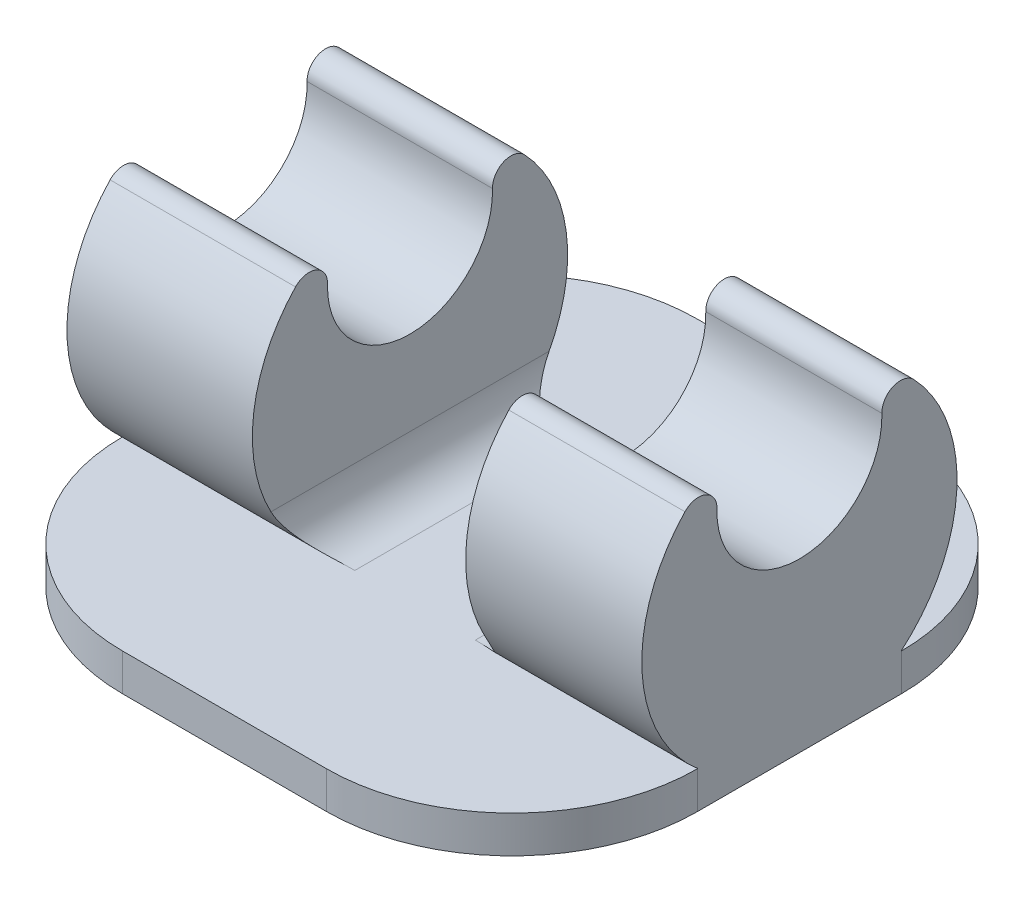
ISO-10303-21;
HEADER;
FILE_DESCRIPTION(('STEP AP214'),'2;1');
FILE_NAME('part.step','',(''),(''),'','','');
FILE_SCHEMA(('AUTOMOTIVE_DESIGN { 1 0 10303 214 1 1 1 1 }'));
ENDSEC;
DATA;
#1=APPLICATION_CONTEXT('core data for automotive mechanical design processes');
#2=APPLICATION_PROTOCOL_DEFINITION('international standard','automotive_design',2000,#1);
#3=PRODUCT_CONTEXT('',#1,'mechanical');
#4=PRODUCT('Part','Part','',(#3));
#5=PRODUCT_RELATED_PRODUCT_CATEGORY('part','',(#4));
#6=PRODUCT_DEFINITION_FORMATION('','',#4);
#7=PRODUCT_DEFINITION_CONTEXT('part definition',#1,'design');
#8=PRODUCT_DEFINITION('design','',#6,#7);
#9=PRODUCT_DEFINITION_SHAPE('','',#8);
#10=(LENGTH_UNIT() NAMED_UNIT(*) SI_UNIT(.MILLI.,.METRE.));
#11=(NAMED_UNIT(*) PLANE_ANGLE_UNIT() SI_UNIT($,.RADIAN.));
#12=(NAMED_UNIT(*) SI_UNIT($,.STERADIAN.) SOLID_ANGLE_UNIT());
#13=UNCERTAINTY_MEASURE_WITH_UNIT(LENGTH_MEASURE(1.E-05),#10,'distance_accuracy_value','');
#14=(GEOMETRIC_REPRESENTATION_CONTEXT(3) GLOBAL_UNCERTAINTY_ASSIGNED_CONTEXT((#13)) GLOBAL_UNIT_ASSIGNED_CONTEXT((#10,
#11,#12)) REPRESENTATION_CONTEXT('',''));
#15=CARTESIAN_POINT('',(0.,0.,0.));
#16=DIRECTION('',(0.,0.,1.));
#17=DIRECTION('',(1.,0.,0.));
#18=AXIS2_PLACEMENT_3D('',#15,#16,#17);
#19=CARTESIAN_POINT('',(-39.5416305603426,8.5,0.));
#20=DIRECTION('',(1.,0.,0.));
#21=DIRECTION('',(0.,0.,-1.));
#22=AXIS2_PLACEMENT_3D('',#19,#20,#21);
#23=CYLINDRICAL_SURFACE('',#22,8.5);
#24=DIRECTION('',(1.,0.,0.));
#25=VECTOR('',#24,1.);
#26=CARTESIAN_POINT('',(-39.5416305603426,2.,5.47722557505166));
#27=LINE('',#26,#25);
#28=CARTESIAN_POINT('',(-15.5,2.,5.47722557505166));
#29=VERTEX_POINT('',#28);
#30=CARTESIAN_POINT('',(-3.,2.,5.47722557505166));
#31=VERTEX_POINT('',#30);
#32=EDGE_CURVE('E314',#29,#31,#27,.T.);
#33=ORIENTED_EDGE('',*,*,#32,.T.);
#34=CARTESIAN_POINT('',(-3.,2.,5.47722557505166));
#35=CARTESIAN_POINT('',(-3.05548023041886,1.99998284746765,5.47719636901179));
#36=CARTESIAN_POINT('',(-3.11093976646165,2.00184610466647,5.47941629204733));
#37=CARTESIAN_POINT('',(-3.22119882620686,2.00919768867053,5.48812748877616));
#38=CARTESIAN_POINT('',(-3.27599921935154,2.01468054270178,5.49461231394811));
#39=CARTESIAN_POINT('',(-3.38380705108872,2.02904505026246,5.51152023657051));
#40=CARTESIAN_POINT('',(-3.43682839160024,2.03788291539298,5.52189257433259));
#41=CARTESIAN_POINT('',(-3.54140164088745,2.05874416325179,5.54621328304563));
#42=CARTESIAN_POINT('',(-3.59295307436981,2.07076856369151,5.5601627964241));
#43=CARTESIAN_POINT('',(-3.74431829426671,2.11110235943785,5.60657231105085));
#44=CARTESIAN_POINT('',(-3.84157745794116,2.14377545707765,5.6437180809062));
#45=CARTESIAN_POINT('',(-4.02819205184219,2.21898803826872,5.72730885639334));
#46=CARTESIAN_POINT('',(-4.11751542478814,2.26156523004117,5.7737893074715));
#47=CARTESIAN_POINT('',(-4.33666214107741,2.38181681439448,5.90163160556171));
#48=CARTESIAN_POINT('',(-4.46037065844433,2.46562393639699,5.98772143833488));
#49=CARTESIAN_POINT('',(-4.68781633607019,2.64993031431786,6.16793360602193));
#50=CARTESIAN_POINT('',(-4.79151879600049,2.75045801959423,6.26206949593661));
#51=CARTESIAN_POINT('',(-4.98214906755177,2.96938192705504,6.45634276600356));
#52=CARTESIAN_POINT('',(-5.0684453392679,3.08824135689828,6.55657578748104));
#53=CARTESIAN_POINT('',(-5.21914818800818,3.33949467404703,6.75609617537811));
#54=CARTESIAN_POINT('',(-5.28359533527579,3.47186287627854,6.85538495803365));
#55=CARTESIAN_POINT('',(-5.36252038858448,3.67905733486903,7.00111906576872));
#56=CARTESIAN_POINT('',(-5.38586177931541,3.7495142777769,7.04913397646161));
#57=CARTESIAN_POINT('',(-5.42635856559128,3.89308550359085,7.14378894845126));
#58=CARTESIAN_POINT('',(-5.4435151732474,3.96619926271133,7.19042927749534));
#59=CARTESIAN_POINT('',(-5.4713430315428,4.11501409200851,7.28213942312598));
#60=CARTESIAN_POINT('',(-5.48198950433371,4.19072390309594,7.32720263150957));
#61=CARTESIAN_POINT('',(-5.49632054031548,4.34405667695937,7.41525510977456));
#62=CARTESIAN_POINT('',(-5.49999987655529,4.42168103189121,7.45824279899818));
#63=CARTESIAN_POINT('',(-5.5,4.5,7.5));
#64=B_SPLINE_CURVE_WITH_KNOTS('',3,(#34,#35,#36,#37,#38,#39,#40,#41,#42,#43,#44,#45,#46,#47,#48,
#49,#50,#51,#52,#53,#54,#55,#56,#57,#58,#59,#60,#61,#62,#63),.UNSPECIFIED.,.F.,.F.,(4,2,2,2,2,2,
2,2,2,2,2,2,2,2,4),(0.,0.166331758041029,0.332412599287027,0.496396452068247,0.660432741045884,
0.986280067977534,1.31338892060558,1.8278986510474,2.34329292491729,2.87492741890114,
3.40556927769404,3.67054852451768,3.93547581169413,4.20140524723328,4.46753411194576),.UNSPECIFIED.);
#65=CARTESIAN_POINT('',(-5.5,4.5,7.5));
#66=VERTEX_POINT('',#65);
#67=EDGE_CURVE('E47',#31,#66,#64,.T.);
#68=ORIENTED_EDGE('',*,*,#67,.T.);
#69=CARTESIAN_POINT('',(-5.5,8.5,0.));
#70=DIRECTION('',(1.,0.,0.));
#71=DIRECTION('',(0.,0.,-1.));
#72=AXIS2_PLACEMENT_3D('',#69,#70,#71);
#73=CIRCLE('',#72,8.5);
#74=CARTESIAN_POINT('',(-5.5,14.34205,6.17417620395627));
#75=VERTEX_POINT('',#74);
#76=EDGE_CURVE('E389',#66,#75,#73,.F.);
#77=ORIENTED_EDGE('',*,*,#76,.T.);
#78=DIRECTION('',(1.,0.,0.));
#79=VECTOR('',#78,1.);
#80=CARTESIAN_POINT('',(-39.5416305603426,14.34205,6.17417620395628));
#81=LINE('',#80,#79);
#82=CARTESIAN_POINT('',(-15.5,14.34205,6.17417620395628));
#83=VERTEX_POINT('',#82);
#84=EDGE_CURVE('E353',#75,#83,#81,.F.);
#85=ORIENTED_EDGE('',*,*,#84,.T.);
#86=CARTESIAN_POINT('',(-15.5,8.5,0.));
#87=DIRECTION('',(1.,0.,0.));
#88=DIRECTION('',(0.,0.,-1.));
#89=AXIS2_PLACEMENT_3D('',#86,#87,#88);
#90=CIRCLE('',#89,8.5);
#91=EDGE_CURVE('E371',#29,#83,#90,.F.);
#92=ORIENTED_EDGE('',*,*,#91,.F.);
#93=EDGE_LOOP('',(#33,#68,#77,#85,#92));
#94=FACE_BOUND('',#93,.T.);
#95=ADVANCED_FACE('F33',(#94),#23,.T.);
#96=CARTESIAN_POINT('',(15.5,14.34205,6.17417620395628));
#97=VERTEX_POINT('',#96);
#98=CARTESIAN_POINT('',(6.00222215077043,14.34205,6.17417620395627));
#99=VERTEX_POINT('',#98);
#100=EDGE_CURVE('E354',#97,#99,#81,.F.);
#101=ORIENTED_EDGE('',*,*,#100,.T.);
#102=CARTESIAN_POINT('',(6.00222215077043,8.5,0.));
#103=DIRECTION('',(-1.,0.,0.));
#104=DIRECTION('',(0.,0.,1.));
#105=AXIS2_PLACEMENT_3D('',#102,#103,#104);
#106=CIRCLE('',#105,8.5);
#107=CARTESIAN_POINT('',(6.00222215077043,4.5,7.5));
#108=VERTEX_POINT('',#107);
#109=EDGE_CURVE('E306',#99,#108,#106,.F.);
#110=ORIENTED_EDGE('',*,*,#109,.T.);
#111=CARTESIAN_POINT('',(6.00222215077043,4.5,7.5));
#112=CARTESIAN_POINT('',(6.00222013599766,4.40532480934401,7.44953326205885));
#113=CARTESIAN_POINT('',(5.99684630339004,4.31168824367521,7.39726593031392));
#114=CARTESIAN_POINT('',(5.97603320552884,4.12737359556319,7.28981472068751));
#115=CARTESIAN_POINT('',(5.96060467770965,4.0366924653497,7.23463401171225));
#116=CARTESIAN_POINT('',(5.92043899443468,3.8593244330836,7.12215851426623));
#117=CARTESIAN_POINT('',(5.8957397732062,3.77262284829421,7.0648731878205));
#118=CARTESIAN_POINT('',(5.83761657626143,3.60337258045722,6.94863943451439));
#119=CARTESIAN_POINT('',(5.80419105113062,3.52082463802474,6.88969071396662));
#120=CARTESIAN_POINT('',(5.70146275915986,3.30124661375149,6.72703049502711));
#121=CARTESIAN_POINT('',(5.62385098719026,3.16878408124438,6.62227486692107));
#122=CARTESIAN_POINT('',(5.44533872410232,2.9195420303512,6.41365137460118));
#123=CARTESIAN_POINT('',(5.3444160585914,2.80277761311708,6.30978445395079));
#124=CARTESIAN_POINT('',(5.13796983265693,2.60492921756946,6.1248169308011));
#125=CARTESIAN_POINT('',(5.03589691300799,2.52113289666896,6.04277078203783));
#126=CARTESIAN_POINT('',(4.81517493186919,2.36830609955503,5.88762369576226));
#127=CARTESIAN_POINT('',(4.69655515786057,2.2992500682568,5.81450737245681));
#128=CARTESIAN_POINT('',(4.47985251634314,2.19694257137392,5.70310709388875));
#129=CARTESIAN_POINT('',(4.38595995944275,2.15913108053088,5.66089819682788));
#130=CARTESIAN_POINT('',(4.19058805168241,2.09445023809222,5.58760440377984));
#131=CARTESIAN_POINT('',(4.08913676885014,2.06754258098347,5.55648061297145));
#132=CARTESIAN_POINT('',(3.90687856980701,2.03169044290814,5.51466524375957));
#133=CARTESIAN_POINT('',(3.82736720599581,2.01992012646884,5.50079276661133));
#134=CARTESIAN_POINT('',(3.70650941242318,2.00802787600596,5.4867415430092));
#135=CARTESIAN_POINT('',(3.66581146901542,2.00502404431862,5.48318358859945));
#136=CARTESIAN_POINT('',(3.58415462014763,2.00100768816681,5.47842161633531));
#137=CARTESIAN_POINT('',(3.54319556375304,1.99999644499591,5.47721911310887));
#138=CARTESIAN_POINT('',(3.50222215077043,2.,5.47722557505166));
#139=B_SPLINE_CURVE_WITH_KNOTS('',3,(#111,#112,#113,#114,#115,#116,#117,#118,#119,#120,#121,
#122,#123,#124,#125,#126,#127,#128,#129,#130,#131,#132,#133,#134,#135,#136,#137,#138),
.UNSPECIFIED.,.F.,.F.,(4,2,2,2,2,2,2,2,2,2,2,2,2,4),(0.,0.321602761200091,0.642862643540117,
0.962822062945265,1.28283833200233,1.83815009571004,2.39399228893269,2.85894682584426,
3.32308860846619,3.65100743990798,3.97776408149686,4.22158813914863,4.34437237887189,
4.46723554677396),.UNSPECIFIED.);
#140=CARTESIAN_POINT('',(3.50222215077042,2.,5.47722557505166));
#141=VERTEX_POINT('',#140);
#142=EDGE_CURVE('E272',#108,#141,#139,.T.);
#143=ORIENTED_EDGE('',*,*,#142,.T.);
#144=CARTESIAN_POINT('',(15.5,2.,5.47722557505166));
#145=VERTEX_POINT('',#144);
#146=EDGE_CURVE('E304',#141,#145,#27,.T.);
#147=ORIENTED_EDGE('',*,*,#146,.T.);
#148=CARTESIAN_POINT('',(15.5,8.5,0.));
#149=DIRECTION('',(1.,0.,0.));
#150=DIRECTION('',(0.,0.,-1.));
#151=AXIS2_PLACEMENT_3D('',#148,#149,#150);
#152=CIRCLE('',#151,8.5);
#153=EDGE_CURVE('E395',#97,#145,#152,.T.);
#154=ORIENTED_EDGE('',*,*,#153,.F.);
#155=EDGE_LOOP('',(#101,#110,#143,#147,#154));
#156=FACE_BOUND('',#155,.T.);
#157=ADVANCED_FACE('F284',(#156),#23,.T.);
#158=DIRECTION('',(1.,0.,0.));
#159=VECTOR('',#158,1.);
#160=CARTESIAN_POINT('',(-39.5416305603426,14.34205,-6.17417620395628));
#161=LINE('',#160,#159);
#162=CARTESIAN_POINT('',(-15.5,14.34205,-6.17417620395629));
#163=VERTEX_POINT('',#162);
#164=CARTESIAN_POINT('',(-5.5,14.34205,-6.17417620395629));
#165=VERTEX_POINT('',#164);
#166=EDGE_CURVE('E208',#163,#165,#161,.T.);
#167=ORIENTED_EDGE('',*,*,#166,.T.);
#168=CARTESIAN_POINT('',(-5.5,8.5,0.));
#169=DIRECTION('',(1.,0.,0.));
#170=DIRECTION('',(0.,0.,-1.));
#171=AXIS2_PLACEMENT_3D('',#168,#169,#170);
#172=CIRCLE('',#171,8.5);
#173=CARTESIAN_POINT('',(-5.5,4.5,-7.5));
#174=VERTEX_POINT('',#173);
#175=EDGE_CURVE('E379',#165,#174,#172,.F.);
#176=ORIENTED_EDGE('',*,*,#175,.T.);
#177=CARTESIAN_POINT('',(-5.5,4.5,-7.5));
#178=CARTESIAN_POINT('',(-5.49999798522723,4.40532480934401,-7.44953326205885));
#179=CARTESIAN_POINT('',(-5.49462415261961,4.31168824367521,-7.39726593031392));
#180=CARTESIAN_POINT('',(-5.47381105475841,4.12737359556319,-7.28981472068751));
#181=CARTESIAN_POINT('',(-5.45838252693921,4.0366924653497,-7.23463401171225));
#182=CARTESIAN_POINT('',(-5.41821684366424,3.8593244330836,-7.12215851426623));
#183=CARTESIAN_POINT('',(-5.39351762243576,3.77262284829421,-7.06487318782051));
#184=CARTESIAN_POINT('',(-5.335394425491,3.60337258045722,-6.94863943451439));
#185=CARTESIAN_POINT('',(-5.30196890036019,3.52082463802474,-6.88969071396662));
#186=CARTESIAN_POINT('',(-5.19924060838942,3.30124661375149,-6.72703049502711));
#187=CARTESIAN_POINT('',(-5.12162883641983,3.16878408124439,-6.62227486692107));
#188=CARTESIAN_POINT('',(-4.94311657333189,2.9195420303512,-6.41365137460118));
#189=CARTESIAN_POINT('',(-4.84219390782097,2.80277761311708,-6.30978445395079));
#190=CARTESIAN_POINT('',(-4.6357476818865,2.60492921756946,-6.1248169308011));
#191=CARTESIAN_POINT('',(-4.53367476223755,2.52113289666896,-6.04277078203783));
#192=CARTESIAN_POINT('',(-4.31295278109875,2.36830609955503,-5.88762369576226));
#193=CARTESIAN_POINT('',(-4.19433300709013,2.2992500682568,-5.8145073724568));
#194=CARTESIAN_POINT('',(-3.9776303655727,2.19694257137392,-5.70310709388874));
#195=CARTESIAN_POINT('',(-3.88373780867232,2.15913108053088,-5.66089819682788));
#196=CARTESIAN_POINT('',(-3.68836590091197,2.09445023809222,-5.58760440377984));
#197=CARTESIAN_POINT('',(-3.5869146180797,2.06754258098347,-5.55648061297145));
#198=CARTESIAN_POINT('',(-3.40465641903657,2.03169044290814,-5.51466524375957));
#199=CARTESIAN_POINT('',(-3.32514505522537,2.01992012646884,-5.50079276661133));
#200=CARTESIAN_POINT('',(-3.20428726165274,2.00802787600596,-5.4867415430092));
#201=CARTESIAN_POINT('',(-3.16358931824499,2.00502404431862,-5.48318358859945));
#202=CARTESIAN_POINT('',(-3.08193246937719,2.00100768816681,-5.47842161633531));
#203=CARTESIAN_POINT('',(-3.04097341298261,1.99999644499591,-5.47721911310888));
#204=CARTESIAN_POINT('',(-3.,2.,-5.47722557505166));
#205=B_SPLINE_CURVE_WITH_KNOTS('',3,(#177,#178,#179,#180,#181,#182,#183,#184,#185,#186,#187,
#188,#189,#190,#191,#192,#193,#194,#195,#196,#197,#198,#199,#200,#201,#202,#203,#204),
.UNSPECIFIED.,.F.,.F.,(4,2,2,2,2,2,2,2,2,2,2,2,2,4),(0.,0.321602761200091,0.642862643540117,
0.962822062945264,1.28283833200233,1.83815009571004,2.39399228893269,2.85894682584426,
3.3230886084662,3.65100743990798,3.97776408149686,4.22158813914863,4.34437237887189,
4.46723554677396),.UNSPECIFIED.);
#206=CARTESIAN_POINT('',(-3.00000000000002,2.,-5.47722557505166));
#207=VERTEX_POINT('',#206);
#208=EDGE_CURVE('E11',#174,#207,#205,.T.);
#209=ORIENTED_EDGE('',*,*,#208,.T.);
#210=DIRECTION('',(1.,0.,0.));
#211=VECTOR('',#210,1.);
#212=CARTESIAN_POINT('',(-39.5416305603426,2.,-5.47722557505166));
#213=LINE('',#212,#211);
#214=CARTESIAN_POINT('',(-15.5,2.,-5.47722557505166));
#215=VERTEX_POINT('',#214);
#216=EDGE_CURVE('E317',#207,#215,#213,.F.);
#217=ORIENTED_EDGE('',*,*,#216,.T.);
#218=EDGE_CURVE('E362',#163,#215,#90,.F.);
#219=ORIENTED_EDGE('',*,*,#218,.F.);
#220=EDGE_LOOP('',(#167,#176,#209,#217,#219));
#221=FACE_BOUND('',#220,.T.);
#222=ADVANCED_FACE('F370',(#221),#23,.T.);
#223=CARTESIAN_POINT('',(15.5,2.,-5.47722557505166));
#224=VERTEX_POINT('',#223);
#225=CARTESIAN_POINT('',(3.50222215077043,2.,-5.47722557505166));
#226=VERTEX_POINT('',#225);
#227=EDGE_CURVE('E310',#224,#226,#213,.F.);
#228=ORIENTED_EDGE('',*,*,#227,.T.);
#229=CARTESIAN_POINT('',(3.50222215077043,2.,-5.47722557505166));
#230=CARTESIAN_POINT('',(3.55770238118929,1.99998284746765,-5.47719636901179));
#231=CARTESIAN_POINT('',(3.61316191723208,2.00184610466647,-5.47941629204732));
#232=CARTESIAN_POINT('',(3.7234209769773,2.00919768867053,-5.48812748877616));
#233=CARTESIAN_POINT('',(3.77822137012197,2.01468054270178,-5.49461231394811));
#234=CARTESIAN_POINT('',(3.88602920185915,2.02904505026246,-5.51152023657051));
#235=CARTESIAN_POINT('',(3.93905054237068,2.03788291539298,-5.52189257433259));
#236=CARTESIAN_POINT('',(4.04362379165788,2.05874416325179,-5.54621328304563));
#237=CARTESIAN_POINT('',(4.09517522514024,2.07076856369151,-5.56016279642409));
#238=CARTESIAN_POINT('',(4.24654044503714,2.11110235943785,-5.60657231105085));
#239=CARTESIAN_POINT('',(4.34379960871159,2.14377545707765,-5.6437180809062));
#240=CARTESIAN_POINT('',(4.53041420261262,2.21898803826872,-5.72730885639333));
#241=CARTESIAN_POINT('',(4.61973757555857,2.26156523004117,-5.7737893074715));
#242=CARTESIAN_POINT('',(4.83888429184784,2.38181681439448,-5.90163160556171));
#243=CARTESIAN_POINT('',(4.96259280921476,2.46562393639698,-5.98772143833488));
#244=CARTESIAN_POINT('',(5.19003848684062,2.64993031431785,-6.16793360602192));
#245=CARTESIAN_POINT('',(5.29374094677092,2.75045801959422,-6.26206949593661));
#246=CARTESIAN_POINT('',(5.4843712183222,2.96938192705503,-6.45634276600355));
#247=CARTESIAN_POINT('',(5.57066749003833,3.08824135689827,-6.55657578748103));
#248=CARTESIAN_POINT('',(5.7213703387786,3.33949467404702,-6.7560961753781));
#249=CARTESIAN_POINT('',(5.78581748604622,3.47186287627852,-6.85538495803365));
#250=CARTESIAN_POINT('',(5.86474253935491,3.67905733486902,-7.00111906576872));
#251=CARTESIAN_POINT('',(5.88808393008584,3.74951427777688,-7.0491339764616));
#252=CARTESIAN_POINT('',(5.92858071636171,3.89308550359084,-7.14378894845125));
#253=CARTESIAN_POINT('',(5.94573732401783,3.96619926271132,-7.19042927749533));
#254=CARTESIAN_POINT('',(5.97356518231323,4.11501409200851,-7.28213942312597));
#255=CARTESIAN_POINT('',(5.98421165510414,4.19072390309594,-7.32720263150957));
#256=CARTESIAN_POINT('',(5.99854269108592,4.34405667695937,-7.41525510977456));
#257=CARTESIAN_POINT('',(6.00222202732572,4.42168103189121,-7.45824279899818));
#258=CARTESIAN_POINT('',(6.00222215077043,4.5,-7.5));
#259=B_SPLINE_CURVE_WITH_KNOTS('',3,(#229,#230,#231,#232,#233,#234,#235,#236,#237,#238,#239,
#240,#241,#242,#243,#244,#245,#246,#247,#248,#249,#250,#251,#252,#253,#254,#255,#256,#257,#258),
.UNSPECIFIED.,.F.,.F.,(4,2,2,2,2,2,2,2,2,2,2,2,2,2,4),(0.,0.166331758041029,0.332412599287026,
0.496396452068246,0.660432741045882,0.986280067977531,1.31338892060558,1.82789865104739,
2.34329292491728,2.87492741890113,3.40556927769402,3.67054852451766,3.93547581169412,
4.20140524723327,4.46753411194576),.UNSPECIFIED.);
#260=CARTESIAN_POINT('',(6.00222215077043,4.5,-7.5));
#261=VERTEX_POINT('',#260);
#262=EDGE_CURVE('E194',#226,#261,#259,.T.);
#263=ORIENTED_EDGE('',*,*,#262,.T.);
#264=CARTESIAN_POINT('',(6.00222215077043,8.5,0.));
#265=DIRECTION('',(-1.,0.,0.));
#266=DIRECTION('',(0.,0.,1.));
#267=AXIS2_PLACEMENT_3D('',#264,#265,#266);
#268=CIRCLE('',#267,8.5);
#269=CARTESIAN_POINT('',(6.00222215077043,14.34205,-6.17417620395629));
#270=VERTEX_POINT('',#269);
#271=EDGE_CURVE('E186',#261,#270,#268,.F.);
#272=ORIENTED_EDGE('',*,*,#271,.T.);
#273=CARTESIAN_POINT('',(15.5,14.34205,-6.17417620395629));
#274=VERTEX_POINT('',#273);
#275=EDGE_CURVE('E191',#270,#274,#161,.T.);
#276=ORIENTED_EDGE('',*,*,#275,.T.);
#277=EDGE_CURVE('E372',#224,#274,#152,.T.);
#278=ORIENTED_EDGE('',*,*,#277,.F.);
#279=EDGE_LOOP('',(#228,#263,#272,#276,#278));
#280=FACE_BOUND('',#279,.T.);
#281=ADVANCED_FACE('F188',(#280),#23,.T.);
#282=CARTESIAN_POINT('',(17.5,13.5,0.));
#283=DIRECTION('',(-1.,0.,0.));
#284=DIRECTION('',(0.,0.,1.));
#285=AXIS2_PLACEMENT_3D('',#282,#283,#284);
#286=CYLINDRICAL_SURFACE('',#285,4.45);
#287=CARTESIAN_POINT('',(-5.5,13.5,0.));
#288=DIRECTION('',(1.,0.,0.));
#289=DIRECTION('',(0.,0.,-1.));
#290=AXIS2_PLACEMENT_3D('',#287,#288,#289);
#291=CIRCLE('',#290,4.45);
#292=CARTESIAN_POINT('',(-5.5,13.6263555045872,-4.44820573787461));
#293=VERTEX_POINT('',#292);
#294=CARTESIAN_POINT('',(-5.5,13.6263555045872,4.4482057378746));
#295=VERTEX_POINT('',#294);
#296=EDGE_CURVE('E377',#293,#295,#291,.F.);
#297=ORIENTED_EDGE('',*,*,#296,.F.);
#298=DIRECTION('',(-1.,0.,0.));
#299=VECTOR('',#298,1.);
#300=CARTESIAN_POINT('',(17.5,13.6263555045872,-4.44820573787461));
#301=LINE('',#300,#299);
#302=CARTESIAN_POINT('',(-15.5,13.6263555045872,-4.4482057378746));
#303=VERTEX_POINT('',#302);
#304=EDGE_CURVE('E333',#293,#303,#301,.T.);
#305=ORIENTED_EDGE('',*,*,#304,.T.);
#306=CARTESIAN_POINT('',(-15.5,13.5,0.));
#307=DIRECTION('',(-1.,0.,0.));
#308=DIRECTION('',(0.,0.,1.));
#309=AXIS2_PLACEMENT_3D('',#306,#307,#308);
#310=CIRCLE('',#309,4.45);
#311=CARTESIAN_POINT('',(-15.5,13.6263555045872,4.4482057378746));
#312=VERTEX_POINT('',#311);
#313=EDGE_CURVE('E364',#303,#312,#310,.T.);
#314=ORIENTED_EDGE('',*,*,#313,.T.);
#315=DIRECTION('',(-1.,0.,0.));
#316=VECTOR('',#315,1.);
#317=CARTESIAN_POINT('',(17.5,13.6263555045872,4.4482057378746));
#318=LINE('',#317,#316);
#319=EDGE_CURVE('E347',#312,#295,#318,.F.);
#320=ORIENTED_EDGE('',*,*,#319,.T.);
#321=EDGE_LOOP('',(#297,#305,#314,#320));
#322=FACE_BOUND('',#321,.T.);
#323=ADVANCED_FACE('F285',(#322),#286,.F.);
#324=CARTESIAN_POINT('',(6.00222215077043,13.5,0.));
#325=DIRECTION('',(-1.,0.,0.));
#326=DIRECTION('',(0.,0.,1.));
#327=AXIS2_PLACEMENT_3D('',#324,#325,#326);
#328=CIRCLE('',#327,4.45);
#329=CARTESIAN_POINT('',(6.00222215077043,13.6263555045872,4.4482057378746));
#330=VERTEX_POINT('',#329);
#331=CARTESIAN_POINT('',(6.00222215077043,13.6263555045872,-4.4482057378746));
#332=VERTEX_POINT('',#331);
#333=EDGE_CURVE('E198',#330,#332,#328,.F.);
#334=ORIENTED_EDGE('',*,*,#333,.F.);
#335=CARTESIAN_POINT('',(15.5,13.6263555045872,4.4482057378746));
#336=VERTEX_POINT('',#335);
#337=EDGE_CURVE('E346',#330,#336,#318,.F.);
#338=ORIENTED_EDGE('',*,*,#337,.T.);
#339=CARTESIAN_POINT('',(15.5,13.5,0.));
#340=DIRECTION('',(-1.,0.,0.));
#341=DIRECTION('',(0.,0.,1.));
#342=AXIS2_PLACEMENT_3D('',#339,#340,#341);
#343=CIRCLE('',#342,4.45);
#344=CARTESIAN_POINT('',(15.5,13.6263555045872,-4.44820573787461));
#345=VERTEX_POINT('',#344);
#346=EDGE_CURVE('E392',#345,#336,#343,.T.);
#347=ORIENTED_EDGE('',*,*,#346,.F.);
#348=EDGE_CURVE('E344',#345,#332,#301,.T.);
#349=ORIENTED_EDGE('',*,*,#348,.T.);
#350=EDGE_LOOP('',(#334,#338,#347,#349));
#351=FACE_BOUND('',#350,.T.);
#352=ADVANCED_FACE('F610',(#351),#286,.F.);
#353=CARTESIAN_POINT('',(-39.5416305603426,13.65475,5.4478025329026));
#354=DIRECTION('',(-1.,0.,0.));
#355=DIRECTION('',(0.,0.,1.));
#356=AXIS2_PLACEMENT_3D('',#353,#354,#355);
#357=CYLINDRICAL_SURFACE('',#356,1.);
#358=ORIENTED_EDGE('',*,*,#84,.F.);
#359=CARTESIAN_POINT('',(-5.5,13.65475,5.44780253290259));
#360=DIRECTION('',(1.,0.,0.));
#361=DIRECTION('',(0.,0.,-1.));
#362=AXIS2_PLACEMENT_3D('',#359,#360,#361);
#363=CIRCLE('',#362,1.);
#364=EDGE_CURVE('E383',#75,#295,#363,.F.);
#365=ORIENTED_EDGE('',*,*,#364,.T.);
#366=ORIENTED_EDGE('',*,*,#319,.F.);
#367=CARTESIAN_POINT('',(-15.5,13.65475,5.4478025329026));
#368=DIRECTION('',(1.,0.,0.));
#369=DIRECTION('',(0.,0.,-1.));
#370=AXIS2_PLACEMENT_3D('',#367,#368,#369);
#371=CIRCLE('',#370,1.);
#372=EDGE_CURVE('E213',#83,#312,#371,.F.);
#373=ORIENTED_EDGE('',*,*,#372,.F.);
#374=EDGE_LOOP('',(#358,#365,#366,#373));
#375=FACE_BOUND('',#374,.T.);
#376=ADVANCED_FACE('F403',(#375),#357,.T.);
#377=ORIENTED_EDGE('',*,*,#337,.F.);
#378=CARTESIAN_POINT('',(6.00222215077043,13.65475,5.44780253290259));
#379=DIRECTION('',(-1.,0.,0.));
#380=DIRECTION('',(0.,0.,1.));
#381=AXIS2_PLACEMENT_3D('',#378,#379,#380);
#382=CIRCLE('',#381,1.);
#383=EDGE_CURVE('E197',#330,#99,#382,.F.);
#384=ORIENTED_EDGE('',*,*,#383,.T.);
#385=ORIENTED_EDGE('',*,*,#100,.F.);
#386=CARTESIAN_POINT('',(15.5,13.65475,5.44780253290259));
#387=DIRECTION('',(-1.,0.,0.));
#388=DIRECTION('',(0.,0.,1.));
#389=AXIS2_PLACEMENT_3D('',#386,#387,#388);
#390=CIRCLE('',#389,1.);
#391=EDGE_CURVE('E351',#336,#97,#390,.F.);
#392=ORIENTED_EDGE('',*,*,#391,.F.);
#393=EDGE_LOOP('',(#377,#384,#385,#392));
#394=FACE_BOUND('',#393,.T.);
#395=ADVANCED_FACE('F593',(#394),#357,.T.);
#396=CARTESIAN_POINT('',(-39.5416305603426,13.65475,-5.4478025329026));
#397=DIRECTION('',(1.,0.,0.));
#398=DIRECTION('',(0.,0.,-1.));
#399=AXIS2_PLACEMENT_3D('',#396,#397,#398);
#400=CYLINDRICAL_SURFACE('',#399,1.);
#401=ORIENTED_EDGE('',*,*,#304,.F.);
#402=CARTESIAN_POINT('',(-5.5,13.65475,-5.44780253290261));
#403=DIRECTION('',(1.,0.,0.));
#404=DIRECTION('',(0.,0.,-1.));
#405=AXIS2_PLACEMENT_3D('',#402,#403,#404);
#406=CIRCLE('',#405,1.);
#407=EDGE_CURVE('E207',#293,#165,#406,.F.);
#408=ORIENTED_EDGE('',*,*,#407,.T.);
#409=ORIENTED_EDGE('',*,*,#166,.F.);
#410=CARTESIAN_POINT('',(-15.5,13.65475,-5.44780253290261));
#411=DIRECTION('',(1.,0.,0.));
#412=DIRECTION('',(0.,0.,-1.));
#413=AXIS2_PLACEMENT_3D('',#410,#411,#412);
#414=CIRCLE('',#413,1.);
#415=EDGE_CURVE('E216',#303,#163,#414,.F.);
#416=ORIENTED_EDGE('',*,*,#415,.F.);
#417=EDGE_LOOP('',(#401,#408,#409,#416));
#418=FACE_BOUND('',#417,.T.);
#419=ADVANCED_FACE('F373',(#418),#400,.T.);
#420=ORIENTED_EDGE('',*,*,#275,.F.);
#421=CARTESIAN_POINT('',(6.00222215077043,13.65475,-5.44780253290261));
#422=DIRECTION('',(-1.,0.,0.));
#423=DIRECTION('',(0.,0.,1.));
#424=AXIS2_PLACEMENT_3D('',#421,#422,#423);
#425=CIRCLE('',#424,1.);
#426=EDGE_CURVE('E201',#270,#332,#425,.F.);
#427=ORIENTED_EDGE('',*,*,#426,.T.);
#428=ORIENTED_EDGE('',*,*,#348,.F.);
#429=CARTESIAN_POINT('',(15.5,13.65475,-5.44780253290261));
#430=DIRECTION('',(-1.,0.,0.));
#431=DIRECTION('',(0.,0.,1.));
#432=AXIS2_PLACEMENT_3D('',#429,#430,#431);
#433=CIRCLE('',#432,1.);
#434=EDGE_CURVE('E212',#274,#345,#433,.F.);
#435=ORIENTED_EDGE('',*,*,#434,.F.);
#436=EDGE_LOOP('',(#420,#427,#428,#435));
#437=FACE_BOUND('',#436,.T.);
#438=ADVANCED_FACE('F211',(#437),#400,.T.);
#439=CARTESIAN_POINT('',(-15.5,2.,-15.5));
#440=DIRECTION('',(1.,0.,0.));
#441=DIRECTION('',(0.,0.,-1.));
#442=AXIS2_PLACEMENT_3D('',#439,#440,#441);
#443=PLANE('',#442);
#444=DIRECTION('',(0.,0.,1.));
#445=VECTOR('',#444,1.);
#446=CARTESIAN_POINT('',(-15.5,2.,-15.5));
#447=LINE('',#446,#445);
#448=CARTESIAN_POINT('',(-15.5,2.,-5.5));
#449=VERTEX_POINT('',#448);
#450=EDGE_CURVE('E326',#449,#215,#447,.T.);
#451=ORIENTED_EDGE('',*,*,#450,.F.);
#452=DIRECTION('',(0.,-1.,0.));
#453=VECTOR('',#452,1.);
#454=CARTESIAN_POINT('',(-15.5,2.,-5.5));
#455=LINE('',#454,#453);
#456=CARTESIAN_POINT('',(-15.5,0.,-5.5));
#457=VERTEX_POINT('',#456);
#458=EDGE_CURVE('E224',#449,#457,#455,.T.);
#459=ORIENTED_EDGE('',*,*,#458,.T.);
#460=DIRECTION('',(0.,0.,1.));
#461=VECTOR('',#460,1.);
#462=CARTESIAN_POINT('',(-15.5,0.,-15.5));
#463=LINE('',#462,#461);
#464=CARTESIAN_POINT('',(-15.5,0.,5.5));
#465=VERTEX_POINT('',#464);
#466=EDGE_CURVE('E316',#457,#465,#463,.T.);
#467=ORIENTED_EDGE('',*,*,#466,.T.);
#468=DIRECTION('',(0.,-1.,0.));
#469=VECTOR('',#468,1.);
#470=CARTESIAN_POINT('',(-15.5,2.,5.5));
#471=LINE('',#470,#469);
#472=CARTESIAN_POINT('',(-15.5,2.,5.5));
#473=VERTEX_POINT('',#472);
#474=EDGE_CURVE('E222',#465,#473,#471,.F.);
#475=ORIENTED_EDGE('',*,*,#474,.T.);
#476=EDGE_CURVE('E324',#29,#473,#447,.T.);
#477=ORIENTED_EDGE('',*,*,#476,.F.);
#478=ORIENTED_EDGE('',*,*,#91,.T.);
#479=ORIENTED_EDGE('',*,*,#372,.T.);
#480=ORIENTED_EDGE('',*,*,#313,.F.);
#481=ORIENTED_EDGE('',*,*,#415,.T.);
#482=ORIENTED_EDGE('',*,*,#218,.T.);
#483=EDGE_LOOP('',(#451,#459,#467,#475,#477,#478,#479,#480,#481,#482));
#484=FACE_BOUND('',#483,.T.);
#485=ADVANCED_FACE('F361',(#484),#443,.F.);
#486=CARTESIAN_POINT('',(-15.5,2.,15.5));
#487=DIRECTION('',(0.,0.,-1.));
#488=DIRECTION('',(-1.,0.,0.));
#489=AXIS2_PLACEMENT_3D('',#486,#487,#488);
#490=PLANE('',#489);
#491=DIRECTION('',(1.,0.,0.));
#492=VECTOR('',#491,1.);
#493=CARTESIAN_POINT('',(-15.5,2.,15.5));
#494=LINE('',#493,#492);
#495=CARTESIAN_POINT('',(-5.5,2.,15.5));
#496=VERTEX_POINT('',#495);
#497=CARTESIAN_POINT('',(5.5,2.,15.5));
#498=VERTEX_POINT('',#497);
#499=EDGE_CURVE('E328',#496,#498,#494,.T.);
#500=ORIENTED_EDGE('',*,*,#499,.F.);
#501=DIRECTION('',(0.,-1.,0.));
#502=VECTOR('',#501,1.);
#503=CARTESIAN_POINT('',(-5.5,2.,15.5));
#504=LINE('',#503,#502);
#505=CARTESIAN_POINT('',(-5.5,0.,15.5));
#506=VERTEX_POINT('',#505);
#507=EDGE_CURVE('E250',#496,#506,#504,.T.);
#508=ORIENTED_EDGE('',*,*,#507,.T.);
#509=DIRECTION('',(1.,0.,0.));
#510=VECTOR('',#509,1.);
#511=CARTESIAN_POINT('',(-15.5,0.,15.5));
#512=LINE('',#511,#510);
#513=CARTESIAN_POINT('',(5.5,0.,15.5));
#514=VERTEX_POINT('',#513);
#515=EDGE_CURVE('E336',#506,#514,#512,.T.);
#516=ORIENTED_EDGE('',*,*,#515,.T.);
#517=DIRECTION('',(0.,-1.,0.));
#518=VECTOR('',#517,1.);
#519=CARTESIAN_POINT('',(5.5,2.,15.5));
#520=LINE('',#519,#518);
#521=EDGE_CURVE('E248',#514,#498,#520,.F.);
#522=ORIENTED_EDGE('',*,*,#521,.T.);
#523=EDGE_LOOP('',(#500,#508,#516,#522));
#524=FACE_BOUND('',#523,.T.);
#525=ADVANCED_FACE('F435',(#524),#490,.F.);
#526=CARTESIAN_POINT('',(15.5,2.,15.5));
#527=DIRECTION('',(-1.,0.,0.));
#528=DIRECTION('',(0.,0.,1.));
#529=AXIS2_PLACEMENT_3D('',#526,#527,#528);
#530=PLANE('',#529);
#531=DIRECTION('',(0.,0.,-1.));
#532=VECTOR('',#531,1.);
#533=CARTESIAN_POINT('',(15.5,2.,15.5));
#534=LINE('',#533,#532);
#535=CARTESIAN_POINT('',(15.5,2.,5.5));
#536=VERTEX_POINT('',#535);
#537=EDGE_CURVE('E313',#536,#145,#534,.T.);
#538=ORIENTED_EDGE('',*,*,#537,.F.);
#539=DIRECTION('',(0.,-1.,0.));
#540=VECTOR('',#539,1.);
#541=CARTESIAN_POINT('',(15.5,2.,5.5));
#542=LINE('',#541,#540);
#543=CARTESIAN_POINT('',(15.5,0.,5.5));
#544=VERTEX_POINT('',#543);
#545=EDGE_CURVE('E255',#536,#544,#542,.T.);
#546=ORIENTED_EDGE('',*,*,#545,.T.);
#547=DIRECTION('',(0.,0.,-1.));
#548=VECTOR('',#547,1.);
#549=CARTESIAN_POINT('',(15.5,0.,15.5));
#550=LINE('',#549,#548);
#551=CARTESIAN_POINT('',(15.5,0.,-5.5));
#552=VERTEX_POINT('',#551);
#553=EDGE_CURVE('E339',#544,#552,#550,.T.);
#554=ORIENTED_EDGE('',*,*,#553,.T.);
#555=DIRECTION('',(0.,-1.,0.));
#556=VECTOR('',#555,1.);
#557=CARTESIAN_POINT('',(15.5,2.,-5.5));
#558=LINE('',#557,#556);
#559=CARTESIAN_POINT('',(15.5,2.,-5.5));
#560=VERTEX_POINT('',#559);
#561=EDGE_CURVE('E253',#552,#560,#558,.F.);
#562=ORIENTED_EDGE('',*,*,#561,.T.);
#563=EDGE_CURVE('E331',#224,#560,#534,.T.);
#564=ORIENTED_EDGE('',*,*,#563,.F.);
#565=ORIENTED_EDGE('',*,*,#277,.T.);
#566=ORIENTED_EDGE('',*,*,#434,.T.);
#567=ORIENTED_EDGE('',*,*,#346,.T.);
#568=ORIENTED_EDGE('',*,*,#391,.T.);
#569=ORIENTED_EDGE('',*,*,#153,.T.);
#570=EDGE_LOOP('',(#538,#546,#554,#562,#564,#565,#566,#567,#568,#569));
#571=FACE_BOUND('',#570,.T.);
#572=ADVANCED_FACE('F426',(#571),#530,.F.);
#573=CARTESIAN_POINT('',(0.,2.,-15.5));
#574=DIRECTION('',(0.,0.,1.));
#575=DIRECTION('',(1.,0.,0.));
#576=AXIS2_PLACEMENT_3D('',#573,#574,#575);
#577=PLANE('',#576);
#578=DIRECTION('',(-1.,0.,0.));
#579=VECTOR('',#578,1.);
#580=CARTESIAN_POINT('',(0.,0.,-15.5));
#581=LINE('',#580,#579);
#582=CARTESIAN_POINT('',(5.5,0.,-15.5));
#583=VERTEX_POINT('',#582);
#584=CARTESIAN_POINT('',(-5.5,0.,-15.5));
#585=VERTEX_POINT('',#584);
#586=EDGE_CURVE('E325',#583,#585,#581,.T.);
#587=ORIENTED_EDGE('',*,*,#586,.T.);
#588=DIRECTION('',(0.,-1.,0.));
#589=VECTOR('',#588,1.);
#590=CARTESIAN_POINT('',(-5.5,2.,-15.5));
#591=LINE('',#590,#589);
#592=CARTESIAN_POINT('',(-5.5,2.,-15.5));
#593=VERTEX_POINT('',#592);
#594=EDGE_CURVE('E238',#585,#593,#591,.F.);
#595=ORIENTED_EDGE('',*,*,#594,.T.);
#596=DIRECTION('',(-1.,0.,0.));
#597=VECTOR('',#596,1.);
#598=CARTESIAN_POINT('',(0.,2.,-15.5));
#599=LINE('',#598,#597);
#600=CARTESIAN_POINT('',(5.5,2.,-15.5));
#601=VERTEX_POINT('',#600);
#602=EDGE_CURVE('E321',#601,#593,#599,.T.);
#603=ORIENTED_EDGE('',*,*,#602,.F.);
#604=DIRECTION('',(0.,-1.,0.));
#605=VECTOR('',#604,1.);
#606=CARTESIAN_POINT('',(5.5,2.,-15.5));
#607=LINE('',#606,#605);
#608=EDGE_CURVE('E235',#601,#583,#607,.T.);
#609=ORIENTED_EDGE('',*,*,#608,.T.);
#610=EDGE_LOOP('',(#587,#595,#603,#609));
#611=FACE_BOUND('',#610,.T.);
#612=ADVANCED_FACE('F417',(#611),#577,.F.);
#613=CARTESIAN_POINT('',(0.,2.,0.));
#614=DIRECTION('',(0.,1.,0.));
#615=DIRECTION('',(0.,0.,1.));
#616=AXIS2_PLACEMENT_3D('',#613,#614,#615);
#617=PLANE('',#616);
#618=DIRECTION('',(0.,0.,-1.));
#619=VECTOR('',#618,1.);
#620=CARTESIAN_POINT('',(3.50222215077043,2.,-5.47722557505166));
#621=LINE('',#620,#619);
#622=EDGE_CURVE('E261',#141,#226,#621,.T.);
#623=ORIENTED_EDGE('',*,*,#622,.T.);
#624=ORIENTED_EDGE('',*,*,#227,.F.);
#625=ORIENTED_EDGE('',*,*,#563,.T.);
#626=CARTESIAN_POINT('',(5.5,2.,-5.5));
#627=DIRECTION('',(0.,1.,0.));
#628=DIRECTION('',(0.,0.,1.));
#629=AXIS2_PLACEMENT_3D('',#626,#627,#628);
#630=CIRCLE('',#629,10.);
#631=EDGE_CURVE('E240',#560,#601,#630,.T.);
#632=ORIENTED_EDGE('',*,*,#631,.T.);
#633=ORIENTED_EDGE('',*,*,#602,.T.);
#634=CARTESIAN_POINT('',(-5.5,2.,-5.5));
#635=DIRECTION('',(0.,1.,0.));
#636=DIRECTION('',(0.,0.,1.));
#637=AXIS2_PLACEMENT_3D('',#634,#635,#636);
#638=CIRCLE('',#637,10.);
#639=EDGE_CURVE('E246',#593,#449,#638,.T.);
#640=ORIENTED_EDGE('',*,*,#639,.T.);
#641=ORIENTED_EDGE('',*,*,#450,.T.);
#642=ORIENTED_EDGE('',*,*,#216,.F.);
#643=DIRECTION('',(0.,0.,1.));
#644=VECTOR('',#643,1.);
#645=CARTESIAN_POINT('',(-3.,2.,5.47722557505166));
#646=LINE('',#645,#644);
#647=EDGE_CURVE('E258',#207,#31,#646,.T.);
#648=ORIENTED_EDGE('',*,*,#647,.T.);
#649=ORIENTED_EDGE('',*,*,#32,.F.);
#650=ORIENTED_EDGE('',*,*,#476,.T.);
#651=CARTESIAN_POINT('',(-5.5,2.,5.5));
#652=DIRECTION('',(0.,1.,0.));
#653=DIRECTION('',(0.,0.,1.));
#654=AXIS2_PLACEMENT_3D('',#651,#652,#653);
#655=CIRCLE('',#654,10.);
#656=EDGE_CURVE('E244',#473,#496,#655,.T.);
#657=ORIENTED_EDGE('',*,*,#656,.T.);
#658=ORIENTED_EDGE('',*,*,#499,.T.);
#659=CARTESIAN_POINT('',(5.5,2.,5.5));
#660=DIRECTION('',(0.,1.,0.));
#661=DIRECTION('',(0.,0.,1.));
#662=AXIS2_PLACEMENT_3D('',#659,#660,#661);
#663=CIRCLE('',#662,10.);
#664=EDGE_CURVE('E242',#498,#536,#663,.T.);
#665=ORIENTED_EDGE('',*,*,#664,.T.);
#666=ORIENTED_EDGE('',*,*,#537,.T.);
#667=ORIENTED_EDGE('',*,*,#146,.F.);
#668=EDGE_LOOP('',(#623,#624,#625,#632,#633,#640,#641,#642,#648,#649,#650,#657,#658,#665,#666,#667));
#669=FACE_BOUND('',#668,.T.);
#670=ADVANCED_FACE('F287',(#669),#617,.T.);
#671=CARTESIAN_POINT('',(0.,0.,0.));
#672=DIRECTION('',(0.,1.,0.));
#673=DIRECTION('',(0.,0.,1.));
#674=AXIS2_PLACEMENT_3D('',#671,#672,#673);
#675=PLANE('',#674);
#676=ORIENTED_EDGE('',*,*,#466,.F.);
#677=CARTESIAN_POINT('',(-5.5,0.,-5.5));
#678=DIRECTION('',(0.,1.,0.));
#679=DIRECTION('',(0.,0.,1.));
#680=AXIS2_PLACEMENT_3D('',#677,#678,#679);
#681=CIRCLE('',#680,10.);
#682=EDGE_CURVE('E233',#457,#585,#681,.F.);
#683=ORIENTED_EDGE('',*,*,#682,.T.);
#684=ORIENTED_EDGE('',*,*,#586,.F.);
#685=CARTESIAN_POINT('',(5.5,0.,-5.5));
#686=DIRECTION('',(0.,1.,0.));
#687=DIRECTION('',(0.,0.,1.));
#688=AXIS2_PLACEMENT_3D('',#685,#686,#687);
#689=CIRCLE('',#688,10.);
#690=EDGE_CURVE('E227',#583,#552,#689,.F.);
#691=ORIENTED_EDGE('',*,*,#690,.T.);
#692=ORIENTED_EDGE('',*,*,#553,.F.);
#693=CARTESIAN_POINT('',(5.5,0.,5.5));
#694=DIRECTION('',(0.,1.,0.));
#695=DIRECTION('',(0.,0.,1.));
#696=AXIS2_PLACEMENT_3D('',#693,#694,#695);
#697=CIRCLE('',#696,10.);
#698=EDGE_CURVE('E229',#544,#514,#697,.F.);
#699=ORIENTED_EDGE('',*,*,#698,.T.);
#700=ORIENTED_EDGE('',*,*,#515,.F.);
#701=CARTESIAN_POINT('',(-5.5,0.,5.5));
#702=DIRECTION('',(0.,1.,0.));
#703=DIRECTION('',(0.,0.,1.));
#704=AXIS2_PLACEMENT_3D('',#701,#702,#703);
#705=CIRCLE('',#704,10.);
#706=EDGE_CURVE('E231',#506,#465,#705,.F.);
#707=ORIENTED_EDGE('',*,*,#706,.T.);
#708=EDGE_LOOP('',(#676,#683,#684,#691,#692,#699,#700,#707));
#709=FACE_BOUND('',#708,.T.);
#710=ADVANCED_FACE('F415',(#709),#675,.F.);
#711=CARTESIAN_POINT('',(-5.5,22.,-15.5));
#712=DIRECTION('',(1.,0.,0.));
#713=DIRECTION('',(0.,0.,-1.));
#714=AXIS2_PLACEMENT_3D('',#711,#712,#713);
#715=PLANE('',#714);
#716=ORIENTED_EDGE('',*,*,#76,.F.);
#717=DIRECTION('',(0.,0.,1.));
#718=VECTOR('',#717,1.);
#719=CARTESIAN_POINT('',(-5.5,4.5,-5.47722557505166));
#720=LINE('',#719,#718);
#721=EDGE_CURVE('E60',#66,#174,#720,.F.);
#722=ORIENTED_EDGE('',*,*,#721,.T.);
#723=ORIENTED_EDGE('',*,*,#175,.F.);
#724=ORIENTED_EDGE('',*,*,#407,.F.);
#725=ORIENTED_EDGE('',*,*,#296,.T.);
#726=ORIENTED_EDGE('',*,*,#364,.F.);
#727=EDGE_LOOP('',(#716,#722,#723,#724,#725,#726));
#728=FACE_BOUND('',#727,.T.);
#729=ADVANCED_FACE('F375',(#728),#715,.T.);
#730=CARTESIAN_POINT('',(6.00222215077043,22.,15.5));
#731=DIRECTION('',(-1.,0.,0.));
#732=DIRECTION('',(0.,0.,1.));
#733=AXIS2_PLACEMENT_3D('',#730,#731,#732);
#734=PLANE('',#733);
#735=ORIENTED_EDGE('',*,*,#271,.F.);
#736=DIRECTION('',(0.,0.,-1.));
#737=VECTOR('',#736,1.);
#738=CARTESIAN_POINT('',(6.00222215077043,4.5,5.47722557505166));
#739=LINE('',#738,#737);
#740=EDGE_CURVE('E264',#261,#108,#739,.F.);
#741=ORIENTED_EDGE('',*,*,#740,.T.);
#742=ORIENTED_EDGE('',*,*,#109,.F.);
#743=ORIENTED_EDGE('',*,*,#383,.F.);
#744=ORIENTED_EDGE('',*,*,#333,.T.);
#745=ORIENTED_EDGE('',*,*,#426,.F.);
#746=EDGE_LOOP('',(#735,#741,#742,#743,#744,#745));
#747=FACE_BOUND('',#746,.T.);
#748=ADVANCED_FACE('F202',(#747),#734,.T.);
#749=CARTESIAN_POINT('',(-5.5,2.,-5.5));
#750=DIRECTION('',(0.,-1.,0.));
#751=DIRECTION('',(0.,0.,-1.));
#752=AXIS2_PLACEMENT_3D('',#749,#750,#751);
#753=CYLINDRICAL_SURFACE('',#752,10.);
#754=ORIENTED_EDGE('',*,*,#639,.F.);
#755=ORIENTED_EDGE('',*,*,#594,.F.);
#756=ORIENTED_EDGE('',*,*,#682,.F.);
#757=ORIENTED_EDGE('',*,*,#458,.F.);
#758=EDGE_LOOP('',(#754,#755,#756,#757));
#759=FACE_BOUND('',#758,.T.);
#760=ADVANCED_FACE('F411',(#759),#753,.T.);
#761=CARTESIAN_POINT('',(-5.5,2.,5.5));
#762=DIRECTION('',(0.,-1.,0.));
#763=DIRECTION('',(0.,0.,-1.));
#764=AXIS2_PLACEMENT_3D('',#761,#762,#763);
#765=CYLINDRICAL_SURFACE('',#764,10.);
#766=ORIENTED_EDGE('',*,*,#656,.F.);
#767=ORIENTED_EDGE('',*,*,#474,.F.);
#768=ORIENTED_EDGE('',*,*,#706,.F.);
#769=ORIENTED_EDGE('',*,*,#507,.F.);
#770=EDGE_LOOP('',(#766,#767,#768,#769));
#771=FACE_BOUND('',#770,.T.);
#772=ADVANCED_FACE('F439',(#771),#765,.T.);
#773=CARTESIAN_POINT('',(5.5,2.,5.5));
#774=DIRECTION('',(0.,-1.,0.));
#775=DIRECTION('',(0.,0.,-1.));
#776=AXIS2_PLACEMENT_3D('',#773,#774,#775);
#777=CYLINDRICAL_SURFACE('',#776,10.);
#778=ORIENTED_EDGE('',*,*,#664,.F.);
#779=ORIENTED_EDGE('',*,*,#521,.F.);
#780=ORIENTED_EDGE('',*,*,#698,.F.);
#781=ORIENTED_EDGE('',*,*,#545,.F.);
#782=EDGE_LOOP('',(#778,#779,#780,#781));
#783=FACE_BOUND('',#782,.T.);
#784=ADVANCED_FACE('F430',(#783),#777,.T.);
#785=CARTESIAN_POINT('',(5.5,2.,-5.5));
#786=DIRECTION('',(0.,-1.,0.));
#787=DIRECTION('',(0.,0.,-1.));
#788=AXIS2_PLACEMENT_3D('',#785,#786,#787);
#789=CYLINDRICAL_SURFACE('',#788,10.);
#790=ORIENTED_EDGE('',*,*,#631,.F.);
#791=ORIENTED_EDGE('',*,*,#561,.F.);
#792=ORIENTED_EDGE('',*,*,#690,.F.);
#793=ORIENTED_EDGE('',*,*,#608,.F.);
#794=EDGE_LOOP('',(#790,#791,#792,#793));
#795=FACE_BOUND('',#794,.T.);
#796=ADVANCED_FACE('F422',(#795),#789,.T.);
#797=CARTESIAN_POINT('',(3.50222215077043,4.5,0.));
#798=DIRECTION('',(0.,0.,1.));
#799=DIRECTION('',(1.,0.,0.));
#800=AXIS2_PLACEMENT_3D('',#797,#798,#799);
#801=CYLINDRICAL_SURFACE('',#800,2.5);
#802=ORIENTED_EDGE('',*,*,#142,.F.);
#803=ORIENTED_EDGE('',*,*,#740,.F.);
#804=ORIENTED_EDGE('',*,*,#262,.F.);
#805=ORIENTED_EDGE('',*,*,#622,.F.);
#806=EDGE_LOOP('',(#802,#803,#804,#805));
#807=FACE_BOUND('',#806,.T.);
#808=ADVANCED_FACE('F277',(#807),#801,.F.);
#809=CARTESIAN_POINT('',(-3.,4.5,0.));
#810=DIRECTION('',(0.,0.,-1.));
#811=DIRECTION('',(-1.,0.,0.));
#812=AXIS2_PLACEMENT_3D('',#809,#810,#811);
#813=CYLINDRICAL_SURFACE('',#812,2.5);
#814=ORIENTED_EDGE('',*,*,#208,.F.);
#815=ORIENTED_EDGE('',*,*,#721,.F.);
#816=ORIENTED_EDGE('',*,*,#67,.F.);
#817=ORIENTED_EDGE('',*,*,#647,.F.);
#818=EDGE_LOOP('',(#814,#815,#816,#817));
#819=FACE_BOUND('',#818,.T.);
#820=ADVANCED_FACE('F35',(#819),#813,.F.);
#821=CLOSED_SHELL('',(#95,#157,#222,#281,#323,#352,#376,#395,#419,#438,#485,#525,#572,#612,#670,
#710,#729,#748,#760,#772,#784,#796,#808,#820));
#822=MANIFOLD_SOLID_BREP('B2',#821);
#823=ADVANCED_BREP_SHAPE_REPRESENTATION('',(#18,#822),#14);
#824=SHAPE_DEFINITION_REPRESENTATION(#9,#823);
ENDSEC;
END-ISO-10303-21;
